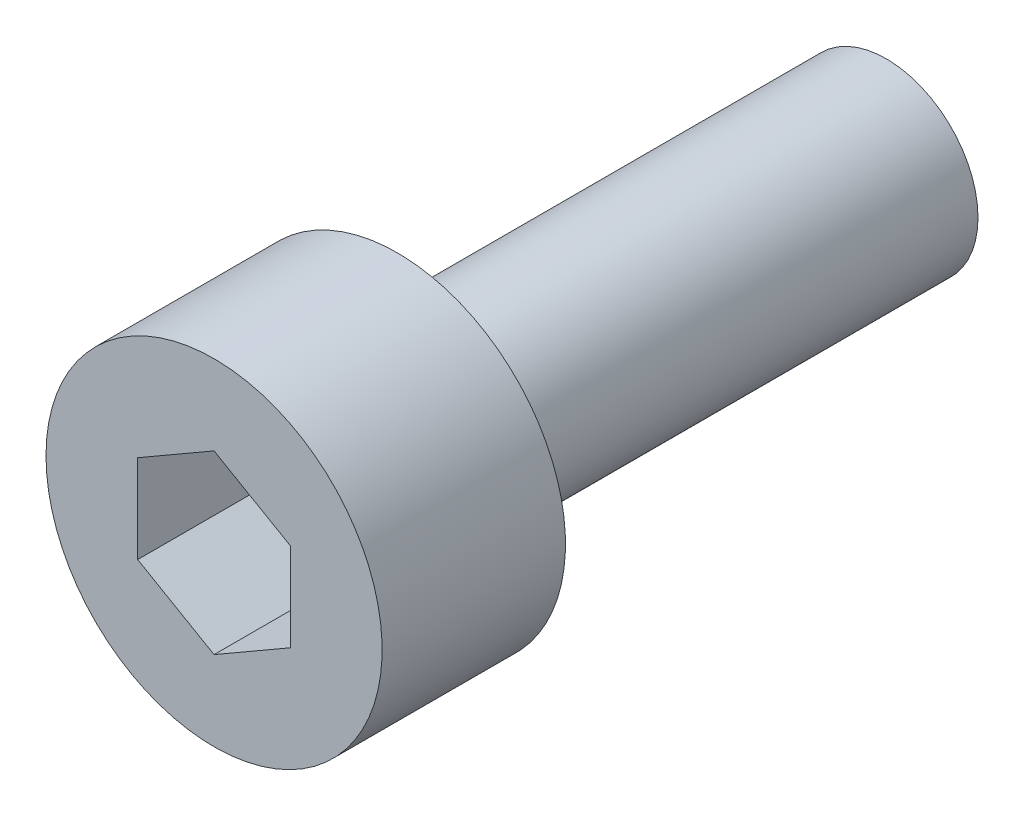
ISO-10303-21;
HEADER;
FILE_DESCRIPTION(('STEP AP214'),'2;1');
FILE_NAME('part.step','',(''),(''),'','','');
FILE_SCHEMA(('AUTOMOTIVE_DESIGN { 1 0 10303 214 1 1 1 1 }'));
ENDSEC;
DATA;
#1=APPLICATION_CONTEXT('core data for automotive mechanical design processes');
#2=APPLICATION_PROTOCOL_DEFINITION('international standard','automotive_design',2000,#1);
#3=PRODUCT_CONTEXT('',#1,'mechanical');
#4=PRODUCT('Part','Part','',(#3));
#5=PRODUCT_RELATED_PRODUCT_CATEGORY('part','',(#4));
#6=PRODUCT_DEFINITION_FORMATION('','',#4);
#7=PRODUCT_DEFINITION_CONTEXT('part definition',#1,'design');
#8=PRODUCT_DEFINITION('design','',#6,#7);
#9=PRODUCT_DEFINITION_SHAPE('','',#8);
#10=(LENGTH_UNIT() NAMED_UNIT(*) SI_UNIT(.MILLI.,.METRE.));
#11=(NAMED_UNIT(*) PLANE_ANGLE_UNIT() SI_UNIT($,.RADIAN.));
#12=(NAMED_UNIT(*) SI_UNIT($,.STERADIAN.) SOLID_ANGLE_UNIT());
#13=UNCERTAINTY_MEASURE_WITH_UNIT(LENGTH_MEASURE(1.E-05),#10,'distance_accuracy_value','');
#14=(GEOMETRIC_REPRESENTATION_CONTEXT(3) GLOBAL_UNCERTAINTY_ASSIGNED_CONTEXT((#13)) GLOBAL_UNIT_ASSIGNED_CONTEXT((#10,
#11,#12)) REPRESENTATION_CONTEXT('',''));
#15=CARTESIAN_POINT('',(0.,0.,0.));
#16=DIRECTION('',(0.,0.,1.));
#17=DIRECTION('',(1.,0.,0.));
#18=AXIS2_PLACEMENT_3D('',#15,#16,#17);
#19=CARTESIAN_POINT('',(1.25,0.721687836,0.5));
#20=DIRECTION('',(0.500000000266546,0.866025403630548,0.));
#21=DIRECTION('',(-0.866025403630548,0.500000000266546,0.));
#22=AXIS2_PLACEMENT_3D('',#19,#20,#21);
#23=PLANE('',#22);
#24=DIRECTION('',(0.,0.,-1.));
#25=VECTOR('',#24,1.);
#26=CARTESIAN_POINT('',(0.,1.443375673,1.75));
#27=LINE('',#26,#25);
#28=CARTESIAN_POINT('',(-6.95750071054088E-10,1.44337567210681,3.));
#29=VERTEX_POINT('',#28);
#30=CARTESIAN_POINT('',(-3.4938569507155E-10,1.44337567279828,0.5));
#31=VERTEX_POINT('',#30);
#32=EDGE_CURVE('E223',#29,#31,#27,.T.);
#33=ORIENTED_EDGE('',*,*,#32,.T.);
#34=DIRECTION('',(-0.866025403630548,0.500000000266546,0.));
#35=VECTOR('',#34,1.);
#36=CARTESIAN_POINT('',(0.625,1.0825317545,0.5));
#37=LINE('',#36,#35);
#38=CARTESIAN_POINT('',(1.25,0.721687836125,0.5));
#39=VERTEX_POINT('',#38);
#40=EDGE_CURVE('E227',#39,#31,#37,.T.);
#41=ORIENTED_EDGE('',*,*,#40,.F.);
#42=DIRECTION('',(0.,0.,1.));
#43=VECTOR('',#42,1.);
#44=CARTESIAN_POINT('',(1.25,0.721687836,1.75));
#45=LINE('',#44,#43);
#46=CARTESIAN_POINT('',(1.250000000351,0.721687836575,3.));
#47=VERTEX_POINT('',#46);
#48=EDGE_CURVE('E213',#39,#47,#45,.T.);
#49=ORIENTED_EDGE('',*,*,#48,.T.);
#50=DIRECTION('',(0.866025403630548,-0.500000000266546,0.));
#51=VECTOR('',#50,1.);
#52=CARTESIAN_POINT('',(0.625,1.0825317545,3.));
#53=LINE('',#52,#51);
#54=EDGE_CURVE('E226',#29,#47,#53,.T.);
#55=ORIENTED_EDGE('',*,*,#54,.F.);
#56=EDGE_LOOP('',(#33,#41,#49,#55));
#57=FACE_BOUND('',#56,.T.);
#58=ADVANCED_FACE('F17',(#57),#23,.F.);
#59=CARTESIAN_POINT('',(0.,1.443375673,0.5));
#60=DIRECTION('',(-0.500000000266546,0.866025403630548,0.));
#61=DIRECTION('',(-0.866025403630548,-0.500000000266546,0.));
#62=AXIS2_PLACEMENT_3D('',#59,#60,#61);
#63=PLANE('',#62);
#64=DIRECTION('',(0.,0.,-1.));
#65=VECTOR('',#64,1.);
#66=CARTESIAN_POINT('',(-1.25,0.721687836,1.75));
#67=LINE('',#66,#65);
#68=CARTESIAN_POINT('',(-1.250000000351,0.721687836575,3.));
#69=VERTEX_POINT('',#68);
#70=CARTESIAN_POINT('',(-1.25,0.721687836125,0.5));
#71=VERTEX_POINT('',#70);
#72=EDGE_CURVE('E100',#69,#71,#67,.T.);
#73=ORIENTED_EDGE('',*,*,#72,.T.);
#74=DIRECTION('',(-0.866025403630548,-0.500000000266546,0.));
#75=VECTOR('',#74,1.);
#76=CARTESIAN_POINT('',(-0.625,1.0825317545,0.5));
#77=LINE('',#76,#75);
#78=EDGE_CURVE('E221',#31,#71,#77,.T.);
#79=ORIENTED_EDGE('',*,*,#78,.F.);
#80=ORIENTED_EDGE('',*,*,#32,.F.);
#81=DIRECTION('',(0.866025403630548,0.500000000266546,0.));
#82=VECTOR('',#81,1.);
#83=CARTESIAN_POINT('',(-0.625,1.0825317545,3.));
#84=LINE('',#83,#82);
#85=EDGE_CURVE('E207',#69,#29,#84,.T.);
#86=ORIENTED_EDGE('',*,*,#85,.F.);
#87=EDGE_LOOP('',(#73,#79,#80,#86));
#88=FACE_BOUND('',#87,.T.);
#89=ADVANCED_FACE('F137',(#88),#63,.F.);
#90=CARTESIAN_POINT('',(1.25,-0.721687836,0.5));
#91=DIRECTION('',(1.,0.,0.));
#92=DIRECTION('',(0.,1.,0.));
#93=AXIS2_PLACEMENT_3D('',#90,#91,#92);
#94=PLANE('',#93);
#95=ORIENTED_EDGE('',*,*,#48,.F.);
#96=DIRECTION('',(0.,-1.,0.));
#97=VECTOR('',#96,1.);
#98=CARTESIAN_POINT('',(1.25,0.,0.5));
#99=LINE('',#98,#97);
#100=CARTESIAN_POINT('',(1.25,-0.72168783625,0.5));
#101=VERTEX_POINT('',#100);
#102=EDGE_CURVE('E99',#39,#101,#99,.T.);
#103=ORIENTED_EDGE('',*,*,#102,.T.);
#104=DIRECTION('',(0.,0.,1.));
#105=VECTOR('',#104,1.);
#106=CARTESIAN_POINT('',(1.25,-0.721687836,1.75));
#107=LINE('',#106,#105);
#108=CARTESIAN_POINT('',(1.250000000351,-0.721687836575,3.));
#109=VERTEX_POINT('',#108);
#110=EDGE_CURVE('E88',#101,#109,#107,.T.);
#111=ORIENTED_EDGE('',*,*,#110,.T.);
#112=DIRECTION('',(0.,-1.,0.));
#113=VECTOR('',#112,1.);
#114=CARTESIAN_POINT('',(1.25,0.,3.));
#115=LINE('',#114,#113);
#116=EDGE_CURVE('E211',#47,#109,#115,.T.);
#117=ORIENTED_EDGE('',*,*,#116,.F.);
#118=EDGE_LOOP('',(#95,#103,#111,#117));
#119=FACE_BOUND('',#118,.T.);
#120=ADVANCED_FACE('F141',(#119),#94,.F.);
#121=CARTESIAN_POINT('',(-1.25,0.721687836,0.5));
#122=DIRECTION('',(-1.,0.,0.));
#123=DIRECTION('',(0.,-1.,0.));
#124=AXIS2_PLACEMENT_3D('',#121,#122,#123);
#125=PLANE('',#124);
#126=DIRECTION('',(0.,0.,-1.));
#127=VECTOR('',#126,1.);
#128=CARTESIAN_POINT('',(-1.25,-0.721687836,1.75));
#129=LINE('',#128,#127);
#130=CARTESIAN_POINT('',(-1.25,-0.7216878375553,3.));
#131=VERTEX_POINT('',#130);
#132=CARTESIAN_POINT('',(-1.25,-0.721687836125,0.5));
#133=VERTEX_POINT('',#132);
#134=EDGE_CURVE('E82',#131,#133,#129,.T.);
#135=ORIENTED_EDGE('',*,*,#134,.T.);
#136=DIRECTION('',(0.,1.,0.));
#137=VECTOR('',#136,1.);
#138=CARTESIAN_POINT('',(-1.25,0.,0.5));
#139=LINE('',#138,#137);
#140=EDGE_CURVE('E77',#133,#71,#139,.T.);
#141=ORIENTED_EDGE('',*,*,#140,.T.);
#142=ORIENTED_EDGE('',*,*,#72,.F.);
#143=DIRECTION('',(0.,1.,0.));
#144=VECTOR('',#143,1.);
#145=CARTESIAN_POINT('',(-1.25,0.,3.));
#146=LINE('',#145,#144);
#147=EDGE_CURVE('E96',#131,#69,#146,.T.);
#148=ORIENTED_EDGE('',*,*,#147,.F.);
#149=EDGE_LOOP('',(#135,#141,#142,#148));
#150=FACE_BOUND('',#149,.T.);
#151=ADVANCED_FACE('F145',(#150),#125,.F.);
#152=CARTESIAN_POINT('',(1.25,-1.443375673,0.5));
#153=DIRECTION('',(0.,0.,-1.));
#154=DIRECTION('',(-1.,0.,0.));
#155=AXIS2_PLACEMENT_3D('',#152,#153,#154);
#156=PLANE('',#155);
#157=DIRECTION('',(0.866025403630548,-0.500000000266546,0.));
#158=VECTOR('',#157,1.);
#159=CARTESIAN_POINT('',(-0.625,-1.0825317545,0.5));
#160=LINE('',#159,#158);
#161=CARTESIAN_POINT('',(6.98771308827936E-10,-1.44337567259656,0.5));
#162=VERTEX_POINT('',#161);
#163=EDGE_CURVE('E70',#133,#162,#160,.T.);
#164=ORIENTED_EDGE('',*,*,#163,.T.);
#165=DIRECTION('',(0.866025403630548,0.500000000266546,0.));
#166=VECTOR('',#165,1.);
#167=CARTESIAN_POINT('',(0.625,-1.0825317545,0.5));
#168=LINE('',#167,#166);
#169=EDGE_CURVE('E74',#162,#101,#168,.T.);
#170=ORIENTED_EDGE('',*,*,#169,.T.);
#171=ORIENTED_EDGE('',*,*,#102,.F.);
#172=ORIENTED_EDGE('',*,*,#40,.T.);
#173=ORIENTED_EDGE('',*,*,#78,.T.);
#174=ORIENTED_EDGE('',*,*,#140,.F.);
#175=EDGE_LOOP('',(#164,#170,#171,#172,#173,#174));
#176=FACE_BOUND('',#175,.T.);
#177=ADVANCED_FACE('F72',(#176),#156,.F.);
#178=CARTESIAN_POINT('',(0.,-1.443375673,0.5));
#179=DIRECTION('',(0.500000000266546,-0.866025403630548,0.));
#180=DIRECTION('',(0.866025403630548,0.500000000266546,0.));
#181=AXIS2_PLACEMENT_3D('',#178,#179,#180);
#182=PLANE('',#181);
#183=ORIENTED_EDGE('',*,*,#110,.F.);
#184=ORIENTED_EDGE('',*,*,#169,.F.);
#185=DIRECTION('',(0.,0.,1.));
#186=VECTOR('',#185,1.);
#187=CARTESIAN_POINT('',(0.,-1.443375673,1.75));
#188=LINE('',#187,#186);
#189=CARTESIAN_POINT('',(8.51303032665242E-10,-1.4433756725085,3.));
#190=VERTEX_POINT('',#189);
#191=EDGE_CURVE('E81',#162,#190,#188,.T.);
#192=ORIENTED_EDGE('',*,*,#191,.T.);
#193=DIRECTION('',(-0.866025403630548,-0.500000000266546,0.));
#194=VECTOR('',#193,1.);
#195=CARTESIAN_POINT('',(0.625,-1.0825317545,3.));
#196=LINE('',#195,#194);
#197=EDGE_CURVE('E34',#109,#190,#196,.T.);
#198=ORIENTED_EDGE('',*,*,#197,.F.);
#199=EDGE_LOOP('',(#183,#184,#192,#198));
#200=FACE_BOUND('',#199,.T.);
#201=ADVANCED_FACE('F85',(#200),#182,.F.);
#202=CARTESIAN_POINT('',(-1.25,-0.721687836,0.5));
#203=DIRECTION('',(-0.500000000266546,-0.866025403630548,0.));
#204=DIRECTION('',(0.866025403630548,-0.500000000266546,0.));
#205=AXIS2_PLACEMENT_3D('',#202,#203,#204);
#206=PLANE('',#205);
#207=ORIENTED_EDGE('',*,*,#191,.F.);
#208=ORIENTED_EDGE('',*,*,#163,.F.);
#209=ORIENTED_EDGE('',*,*,#134,.F.);
#210=DIRECTION('',(-0.866025405153528,0.499999997628667,0.));
#211=VECTOR('',#210,1.);
#212=CARTESIAN_POINT('',(0.,-1.443375671034,3.));
#213=LINE('',#212,#211);
#214=EDGE_CURVE('E21',#190,#131,#213,.T.);
#215=ORIENTED_EDGE('',*,*,#214,.F.);
#216=EDGE_LOOP('',(#207,#208,#209,#215));
#217=FACE_BOUND('',#216,.T.);
#218=ADVANCED_FACE('F90',(#217),#206,.F.);
#219=CARTESIAN_POINT('',(-2.783,-2.783,3.));
#220=DIRECTION('',(0.,0.,1.));
#221=DIRECTION('',(1.,0.,0.));
#222=AXIS2_PLACEMENT_3D('',#219,#220,#221);
#223=PLANE('',#222);
#224=ORIENTED_EDGE('',*,*,#197,.T.);
#225=ORIENTED_EDGE('',*,*,#214,.T.);
#226=ORIENTED_EDGE('',*,*,#147,.T.);
#227=ORIENTED_EDGE('',*,*,#85,.T.);
#228=ORIENTED_EDGE('',*,*,#54,.T.);
#229=ORIENTED_EDGE('',*,*,#116,.T.);
#230=EDGE_LOOP('',(#224,#225,#226,#227,#228,#229));
#231=FACE_BOUND('',#230,.T.);
#232=CARTESIAN_POINT('',(0.,0.,3.));
#233=DIRECTION('',(0.,0.,-1.));
#234=DIRECTION('',(-1.,0.,0.));
#235=AXIS2_PLACEMENT_3D('',#232,#233,#234);
#236=CIRCLE('',#235,2.75);
#237=CARTESIAN_POINT('',(-2.75,0.,3.));
#238=VERTEX_POINT('',#237);
#239=EDGE_CURVE('E92',#238,#238,#236,.F.);
#240=ORIENTED_EDGE('',*,*,#239,.T.);
#241=EDGE_LOOP('',(#240));
#242=FACE_BOUND('',#241,.T.);
#243=ADVANCED_FACE('F109',(#231,#242),#223,.T.);
#244=CARTESIAN_POINT('',(0.,0.,3.));
#245=DIRECTION('',(0.,0.,-1.));
#246=DIRECTION('',(-1.,0.,0.));
#247=AXIS2_PLACEMENT_3D('',#244,#245,#246);
#248=CYLINDRICAL_SURFACE('',#247,2.75);
#249=ORIENTED_EDGE('',*,*,#239,.F.);
#250=EDGE_LOOP('',(#249));
#251=FACE_BOUND('',#250,.T.);
#252=CARTESIAN_POINT('',(0.,0.,0.));
#253=DIRECTION('',(0.,0.,-1.));
#254=DIRECTION('',(-1.,0.,0.));
#255=AXIS2_PLACEMENT_3D('',#252,#253,#254);
#256=CIRCLE('',#255,2.75);
#257=CARTESIAN_POINT('',(-2.75,0.,0.));
#258=VERTEX_POINT('',#257);
#259=EDGE_CURVE('E104',#258,#258,#256,.F.);
#260=ORIENTED_EDGE('',*,*,#259,.T.);
#261=EDGE_LOOP('',(#260));
#262=FACE_BOUND('',#261,.T.);
#263=ADVANCED_FACE('F111',(#251,#262),#248,.T.);
#264=CARTESIAN_POINT('',(-2.783,-2.783,0.));
#265=DIRECTION('',(0.,0.,1.));
#266=DIRECTION('',(1.,0.,0.));
#267=AXIS2_PLACEMENT_3D('',#264,#265,#266);
#268=PLANE('',#267);
#269=CARTESIAN_POINT('',(0.,0.,0.));
#270=DIRECTION('',(0.,0.,1.));
#271=DIRECTION('',(1.,0.,0.));
#272=AXIS2_PLACEMENT_3D('',#269,#270,#271);
#273=CIRCLE('',#272,1.5);
#274=CARTESIAN_POINT('',(1.5,0.,0.));
#275=VERTEX_POINT('',#274);
#276=EDGE_CURVE('E27',#275,#275,#273,.T.);
#277=ORIENTED_EDGE('',*,*,#276,.T.);
#278=EDGE_LOOP('',(#277));
#279=FACE_BOUND('',#278,.T.);
#280=ORIENTED_EDGE('',*,*,#259,.F.);
#281=EDGE_LOOP('',(#280));
#282=FACE_BOUND('',#281,.T.);
#283=ADVANCED_FACE('F114',(#279,#282),#268,.F.);
#284=CARTESIAN_POINT('',(1.518,-1.518,-8.));
#285=DIRECTION('',(0.,0.,-1.));
#286=DIRECTION('',(-1.,0.,0.));
#287=AXIS2_PLACEMENT_3D('',#284,#285,#286);
#288=PLANE('',#287);
#289=CARTESIAN_POINT('',(0.,0.,-8.));
#290=DIRECTION('',(0.,0.,1.));
#291=DIRECTION('',(1.,0.,0.));
#292=AXIS2_PLACEMENT_3D('',#289,#290,#291);
#293=CIRCLE('',#292,1.5);
#294=CARTESIAN_POINT('',(1.5,0.,-8.));
#295=VERTEX_POINT('',#294);
#296=EDGE_CURVE('E11',#295,#295,#293,.F.);
#297=ORIENTED_EDGE('',*,*,#296,.T.);
#298=EDGE_LOOP('',(#297));
#299=FACE_BOUND('',#298,.T.);
#300=ADVANCED_FACE('F19',(#299),#288,.T.);
#301=CARTESIAN_POINT('',(0.,0.,-8.));
#302=DIRECTION('',(0.,0.,1.));
#303=DIRECTION('',(1.,0.,0.));
#304=AXIS2_PLACEMENT_3D('',#301,#302,#303);
#305=CYLINDRICAL_SURFACE('',#304,1.5);
#306=ORIENTED_EDGE('',*,*,#276,.F.);
#307=EDGE_LOOP('',(#306));
#308=FACE_BOUND('',#307,.T.);
#309=ORIENTED_EDGE('',*,*,#296,.F.);
#310=EDGE_LOOP('',(#309));
#311=FACE_BOUND('',#310,.T.);
#312=ADVANCED_FACE('F124',(#308,#311),#305,.T.);
#313=CLOSED_SHELL('',(#58,#89,#120,#151,#177,#201,#218,#243,#263,#283,#300,#312));
#314=MANIFOLD_SOLID_BREP('B1',#313);
#315=ADVANCED_BREP_SHAPE_REPRESENTATION('',(#18,#314),#14);
#316=SHAPE_DEFINITION_REPRESENTATION(#9,#315);
ENDSEC;
END-ISO-10303-21;
